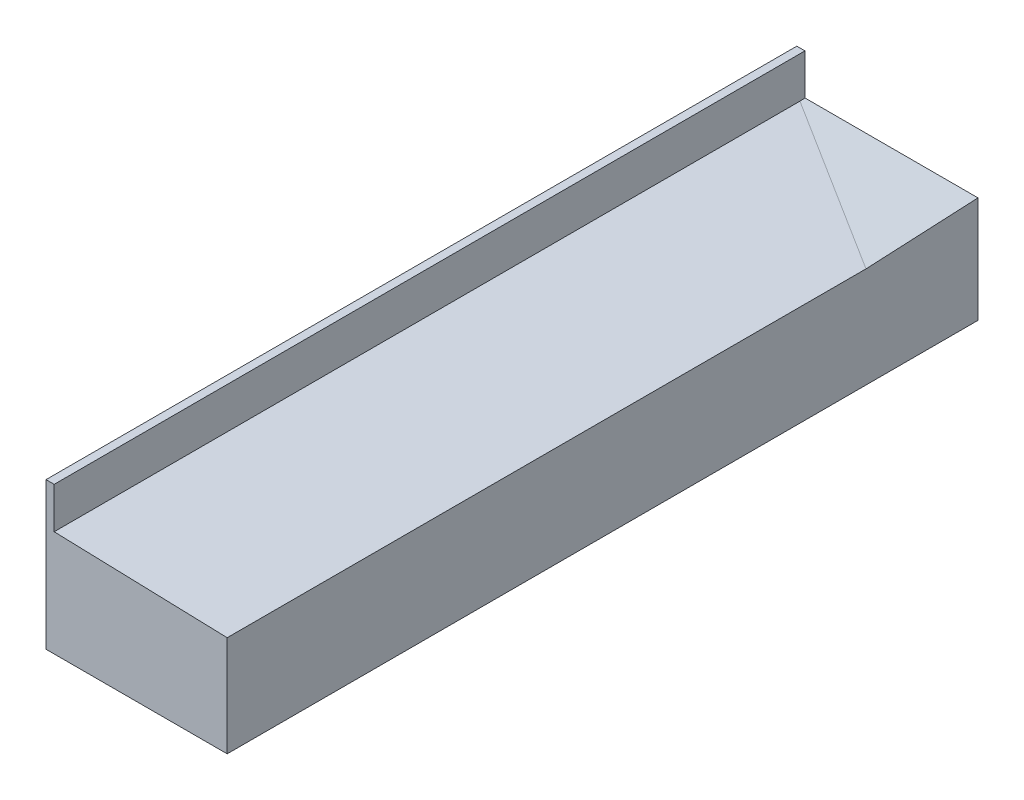
ISO-10303-21;
HEADER;
FILE_DESCRIPTION(('STEP AP214'),'2;1');
FILE_NAME('part.step','',(''),(''),'','','');
FILE_SCHEMA(('AUTOMOTIVE_DESIGN { 1 0 10303 214 1 1 1 1 }'));
ENDSEC;
DATA;
#1=APPLICATION_CONTEXT('core data for automotive mechanical design processes');
#2=APPLICATION_PROTOCOL_DEFINITION('international standard','automotive_design',2000,#1);
#3=PRODUCT_CONTEXT('',#1,'mechanical');
#4=PRODUCT('Part','Part','',(#3));
#5=PRODUCT_RELATED_PRODUCT_CATEGORY('part','',(#4));
#6=PRODUCT_DEFINITION_FORMATION('','',#4);
#7=PRODUCT_DEFINITION_CONTEXT('part definition',#1,'design');
#8=PRODUCT_DEFINITION('design','',#6,#7);
#9=PRODUCT_DEFINITION_SHAPE('','',#8);
#10=(LENGTH_UNIT() NAMED_UNIT(*) SI_UNIT(.MILLI.,.METRE.));
#11=(NAMED_UNIT(*) PLANE_ANGLE_UNIT() SI_UNIT($,.RADIAN.));
#12=(NAMED_UNIT(*) SI_UNIT($,.STERADIAN.) SOLID_ANGLE_UNIT());
#13=UNCERTAINTY_MEASURE_WITH_UNIT(LENGTH_MEASURE(1.E-05),#10,'distance_accuracy_value','');
#14=(GEOMETRIC_REPRESENTATION_CONTEXT(3) GLOBAL_UNCERTAINTY_ASSIGNED_CONTEXT((#13)) GLOBAL_UNIT_ASSIGNED_CONTEXT((#10,
#11,#12)) REPRESENTATION_CONTEXT('',''));
#15=CARTESIAN_POINT('',(0.,0.,0.));
#16=DIRECTION('',(0.,0.,1.));
#17=DIRECTION('',(1.,0.,0.));
#18=AXIS2_PLACEMENT_3D('',#15,#16,#17);
#19=CARTESIAN_POINT('',(-278.13,0.,0.));
#20=DIRECTION('',(-1.,0.,0.));
#21=DIRECTION('',(0.,0.,1.));
#22=AXIS2_PLACEMENT_3D('',#19,#20,#21);
#23=PLANE('',#22);
#24=DIRECTION('',(0.,-0.0489608186254638,0.998800699959469));
#25=VECTOR('',#24,1.);
#26=CARTESIAN_POINT('',(-278.13,82.55,-584.2));
#27=LINE('',#26,#25);
#28=CARTESIAN_POINT('',(-278.13,82.55,-584.2));
#29=VERTEX_POINT('',#28);
#30=CARTESIAN_POINT('',(-278.13,78.2781818181818,-497.054909090909));
#31=VERTEX_POINT('',#30);
#32=EDGE_CURVE('E46',#29,#31,#27,.T.);
#33=ORIENTED_EDGE('',*,*,#32,.T.);
#34=DIRECTION('',(0.,0.,1.));
#35=VECTOR('',#34,1.);
#36=CARTESIAN_POINT('',(-278.13,78.2781818181818,-584.2));
#37=LINE('',#36,#35);
#38=CARTESIAN_POINT('',(-278.13,78.2781818181818,0.));
#39=VERTEX_POINT('',#38);
#40=EDGE_CURVE('E171',#31,#39,#37,.T.);
#41=ORIENTED_EDGE('',*,*,#40,.T.);
#42=DIRECTION('',(0.,1.,0.));
#43=VECTOR('',#42,1.);
#44=CARTESIAN_POINT('',(-278.13,0.,0.));
#45=LINE('',#44,#43);
#46=CARTESIAN_POINT('',(-278.13,0.,0.));
#47=VERTEX_POINT('',#46);
#48=EDGE_CURVE('E168',#47,#39,#45,.T.);
#49=ORIENTED_EDGE('',*,*,#48,.F.);
#50=DIRECTION('',(0.,0.,-1.));
#51=VECTOR('',#50,1.);
#52=CARTESIAN_POINT('',(-278.13,0.,-584.2));
#53=LINE('',#52,#51);
#54=CARTESIAN_POINT('',(-278.13,0.,-584.2));
#55=VERTEX_POINT('',#54);
#56=EDGE_CURVE('E52',#47,#55,#53,.T.);
#57=ORIENTED_EDGE('',*,*,#56,.T.);
#58=DIRECTION('',(0.,1.,0.));
#59=VECTOR('',#58,1.);
#60=CARTESIAN_POINT('',(-278.13,0.,-584.2));
#61=LINE('',#60,#59);
#62=EDGE_CURVE('E11',#55,#29,#61,.T.);
#63=ORIENTED_EDGE('',*,*,#62,.T.);
#64=EDGE_LOOP('',(#33,#41,#49,#57,#63));
#65=FACE_BOUND('',#64,.T.);
#66=ADVANCED_FACE('F43',(#65),#23,.F.);
#67=CARTESIAN_POINT('',(-943.794471192522,82.55,-584.2));
#68=DIRECTION('',(0.,0.998800699959469,0.0489608186254638));
#69=DIRECTION('',(0.,-0.0489608186254638,0.998800699959469));
#70=AXIS2_PLACEMENT_3D('',#67,#68,#69);
#71=PLANE('',#70);
#72=ORIENTED_EDGE('',*,*,#32,.F.);
#73=DIRECTION('',(1.,0.,0.));
#74=VECTOR('',#73,1.);
#75=CARTESIAN_POINT('',(-943.794471192522,82.55,-584.2));
#76=LINE('',#75,#74);
#77=CARTESIAN_POINT('',(-412.75,82.55,-584.2));
#78=VERTEX_POINT('',#77);
#79=EDGE_CURVE('E134',#78,#29,#76,.T.);
#80=ORIENTED_EDGE('',*,*,#79,.F.);
#81=DIRECTION('',(0.,-0.0489608186254638,0.998800699959469));
#82=VECTOR('',#81,1.);
#83=CARTESIAN_POINT('',(-412.75,82.55,-584.2));
#84=LINE('',#83,#82);
#85=CARTESIAN_POINT('',(-412.75,82.3575757575758,-580.274545454545));
#86=VERTEX_POINT('',#85);
#87=EDGE_CURVE('E164',#78,#86,#84,.T.);
#88=ORIENTED_EDGE('',*,*,#87,.T.);
#89=DIRECTION('',(0.850312150745116,-0.025767034871064,0.525647511369709));
#90=VECTOR('',#89,1.);
#91=CARTESIAN_POINT('',(-419.1,82.55,-584.2));
#92=LINE('',#91,#90);
#93=EDGE_CURVE('E141',#86,#31,#92,.T.);
#94=ORIENTED_EDGE('',*,*,#93,.T.);
#95=EDGE_LOOP('',(#72,#80,#88,#94));
#96=FACE_BOUND('',#95,.T.);
#97=ADVANCED_FACE('F181',(#96),#71,.T.);
#98=CARTESIAN_POINT('',(-419.1,0.,-584.2));
#99=DIRECTION('',(-1.,0.,0.));
#100=DIRECTION('',(0.,0.,1.));
#101=AXIS2_PLACEMENT_3D('',#98,#99,#100);
#102=PLANE('',#101);
#103=DIRECTION('',(0.,0.,1.));
#104=VECTOR('',#103,1.);
#105=CARTESIAN_POINT('',(-419.1,0.,-584.2));
#106=LINE('',#105,#104);
#107=CARTESIAN_POINT('',(-419.1,0.,-584.2));
#108=VERTEX_POINT('',#107);
#109=CARTESIAN_POINT('',(-419.1,0.,0.));
#110=VERTEX_POINT('',#109);
#111=EDGE_CURVE('E154',#108,#110,#106,.T.);
#112=ORIENTED_EDGE('',*,*,#111,.T.);
#113=DIRECTION('',(0.,-1.,0.));
#114=VECTOR('',#113,1.);
#115=CARTESIAN_POINT('',(-419.1,0.,0.));
#116=LINE('',#115,#114);
#117=CARTESIAN_POINT('',(-419.1,114.3,0.));
#118=VERTEX_POINT('',#117);
#119=EDGE_CURVE('E157',#118,#110,#116,.T.);
#120=ORIENTED_EDGE('',*,*,#119,.F.);
#121=DIRECTION('',(0.,0.,1.));
#122=VECTOR('',#121,1.);
#123=CARTESIAN_POINT('',(-419.1,114.3,-584.2));
#124=LINE('',#123,#122);
#125=CARTESIAN_POINT('',(-419.1,114.3,-584.2));
#126=VERTEX_POINT('',#125);
#127=EDGE_CURVE('E120',#126,#118,#124,.T.);
#128=ORIENTED_EDGE('',*,*,#127,.F.);
#129=DIRECTION('',(0.,-1.,0.));
#130=VECTOR('',#129,1.);
#131=CARTESIAN_POINT('',(-419.1,0.,-584.2));
#132=LINE('',#131,#130);
#133=EDGE_CURVE('E145',#126,#108,#132,.T.);
#134=ORIENTED_EDGE('',*,*,#133,.T.);
#135=EDGE_LOOP('',(#112,#120,#128,#134));
#136=FACE_BOUND('',#135,.T.);
#137=ADVANCED_FACE('F189',(#136),#102,.T.);
#138=CARTESIAN_POINT('',(0.,114.3,0.));
#139=DIRECTION('',(0.,-1.,0.));
#140=DIRECTION('',(0.,0.,-1.));
#141=AXIS2_PLACEMENT_3D('',#138,#139,#140);
#142=PLANE('',#141);
#143=DIRECTION('',(1.,0.,0.));
#144=VECTOR('',#143,1.);
#145=CARTESIAN_POINT('',(-419.1,114.3,0.));
#146=LINE('',#145,#144);
#147=CARTESIAN_POINT('',(-412.75,114.3,0.));
#148=VERTEX_POINT('',#147);
#149=EDGE_CURVE('E114',#118,#148,#146,.T.);
#150=ORIENTED_EDGE('',*,*,#149,.T.);
#151=DIRECTION('',(0.,0.,-1.));
#152=VECTOR('',#151,1.);
#153=CARTESIAN_POINT('',(-412.75,114.3,-6.35));
#154=LINE('',#153,#152);
#155=CARTESIAN_POINT('',(-412.75,114.3,-584.2));
#156=VERTEX_POINT('',#155);
#157=EDGE_CURVE('E101',#148,#156,#154,.T.);
#158=ORIENTED_EDGE('',*,*,#157,.T.);
#159=DIRECTION('',(-1.,0.,0.));
#160=VECTOR('',#159,1.);
#161=CARTESIAN_POINT('',(-419.1,114.3,-584.2));
#162=LINE('',#161,#160);
#163=EDGE_CURVE('E113',#156,#126,#162,.T.);
#164=ORIENTED_EDGE('',*,*,#163,.T.);
#165=ORIENTED_EDGE('',*,*,#127,.T.);
#166=EDGE_LOOP('',(#150,#158,#164,#165));
#167=FACE_BOUND('',#166,.T.);
#168=ADVANCED_FACE('F118',(#167),#142,.F.);
#169=CARTESIAN_POINT('',(-412.75,114.3,-579.774242424242));
#170=DIRECTION('',(-1.,0.,0.));
#171=DIRECTION('',(0.,0.,1.));
#172=AXIS2_PLACEMENT_3D('',#169,#170,#171);
#173=PLANE('',#172);
#174=DIRECTION('',(0.,0.,1.));
#175=VECTOR('',#174,1.);
#176=CARTESIAN_POINT('',(-412.75,82.3575757575758,-584.2));
#177=LINE('',#176,#175);
#178=CARTESIAN_POINT('',(-412.75,82.3575757575758,0.));
#179=VERTEX_POINT('',#178);
#180=EDGE_CURVE('E130',#86,#179,#177,.T.);
#181=ORIENTED_EDGE('',*,*,#180,.F.);
#182=ORIENTED_EDGE('',*,*,#87,.F.);
#183=DIRECTION('',(0.,-1.,0.));
#184=VECTOR('',#183,1.);
#185=CARTESIAN_POINT('',(-412.75,114.3,-584.2));
#186=LINE('',#185,#184);
#187=EDGE_CURVE('E108',#156,#78,#186,.T.);
#188=ORIENTED_EDGE('',*,*,#187,.F.);
#189=ORIENTED_EDGE('',*,*,#157,.F.);
#190=DIRECTION('',(0.,-1.,0.));
#191=VECTOR('',#190,1.);
#192=CARTESIAN_POINT('',(-412.75,114.3,0.));
#193=LINE('',#192,#191);
#194=EDGE_CURVE('E105',#148,#179,#193,.T.);
#195=ORIENTED_EDGE('',*,*,#194,.T.);
#196=EDGE_LOOP('',(#181,#182,#188,#189,#195));
#197=FACE_BOUND('',#196,.T.);
#198=ADVANCED_FACE('F103',(#197),#173,.F.);
#199=CARTESIAN_POINT('',(-419.1,82.55,-584.2));
#200=DIRECTION('',(0.0302891266407689,0.999541179145381,0.));
#201=DIRECTION('',(-0.999541179145382,0.030289126640769,0.));
#202=AXIS2_PLACEMENT_3D('',#199,#200,#201);
#203=PLANE('',#202);
#204=ORIENTED_EDGE('',*,*,#40,.F.);
#205=ORIENTED_EDGE('',*,*,#93,.F.);
#206=ORIENTED_EDGE('',*,*,#180,.T.);
#207=DIRECTION('',(-0.999541179145381,0.030289126640769,0.));
#208=VECTOR('',#207,1.);
#209=CARTESIAN_POINT('',(-419.1,82.55,0.));
#210=LINE('',#209,#208);
#211=EDGE_CURVE('E128',#39,#179,#210,.T.);
#212=ORIENTED_EDGE('',*,*,#211,.F.);
#213=EDGE_LOOP('',(#204,#205,#206,#212));
#214=FACE_BOUND('',#213,.T.);
#215=ADVANCED_FACE('F183',(#214),#203,.T.);
#216=CARTESIAN_POINT('',(-419.1,0.,-584.2));
#217=DIRECTION('',(0.,-1.,0.));
#218=DIRECTION('',(0.,0.,-1.));
#219=AXIS2_PLACEMENT_3D('',#216,#217,#218);
#220=PLANE('',#219);
#221=ORIENTED_EDGE('',*,*,#56,.F.);
#222=DIRECTION('',(1.,0.,0.));
#223=VECTOR('',#222,1.);
#224=CARTESIAN_POINT('',(-419.1,0.,0.));
#225=LINE('',#224,#223);
#226=EDGE_CURVE('E150',#110,#47,#225,.T.);
#227=ORIENTED_EDGE('',*,*,#226,.F.);
#228=ORIENTED_EDGE('',*,*,#111,.F.);
#229=DIRECTION('',(1.,0.,0.));
#230=VECTOR('',#229,1.);
#231=CARTESIAN_POINT('',(-419.1,0.,-584.2));
#232=LINE('',#231,#230);
#233=EDGE_CURVE('E149',#108,#55,#232,.T.);
#234=ORIENTED_EDGE('',*,*,#233,.T.);
#235=EDGE_LOOP('',(#221,#227,#228,#234));
#236=FACE_BOUND('',#235,.T.);
#237=ADVANCED_FACE('F192',(#236),#220,.T.);
#238=CARTESIAN_POINT('',(0.,0.,0.));
#239=DIRECTION('',(0.,0.,-1.));
#240=DIRECTION('',(-1.,0.,0.));
#241=AXIS2_PLACEMENT_3D('',#238,#239,#240);
#242=PLANE('',#241);
#243=ORIENTED_EDGE('',*,*,#226,.T.);
#244=ORIENTED_EDGE('',*,*,#48,.T.);
#245=ORIENTED_EDGE('',*,*,#211,.T.);
#246=ORIENTED_EDGE('',*,*,#194,.F.);
#247=ORIENTED_EDGE('',*,*,#149,.F.);
#248=ORIENTED_EDGE('',*,*,#119,.T.);
#249=EDGE_LOOP('',(#243,#244,#245,#246,#247,#248));
#250=FACE_BOUND('',#249,.T.);
#251=ADVANCED_FACE('F126',(#250),#242,.F.);
#252=CARTESIAN_POINT('',(0.,0.,-584.2));
#253=DIRECTION('',(0.,0.,-1.));
#254=DIRECTION('',(-1.,0.,0.));
#255=AXIS2_PLACEMENT_3D('',#252,#253,#254);
#256=PLANE('',#255);
#257=ORIENTED_EDGE('',*,*,#62,.F.);
#258=ORIENTED_EDGE('',*,*,#233,.F.);
#259=ORIENTED_EDGE('',*,*,#133,.F.);
#260=ORIENTED_EDGE('',*,*,#163,.F.);
#261=ORIENTED_EDGE('',*,*,#187,.T.);
#262=ORIENTED_EDGE('',*,*,#79,.T.);
#263=EDGE_LOOP('',(#257,#258,#259,#260,#261,#262));
#264=FACE_BOUND('',#263,.T.);
#265=ADVANCED_FACE('F184',(#264),#256,.T.);
#266=CLOSED_SHELL('',(#66,#97,#137,#168,#198,#215,#237,#251,#265));
#267=MANIFOLD_SOLID_BREP('B2',#266);
#268=ADVANCED_BREP_SHAPE_REPRESENTATION('',(#18,#267),#14);
#269=SHAPE_DEFINITION_REPRESENTATION(#9,#268);
ENDSEC;
END-ISO-10303-21;
